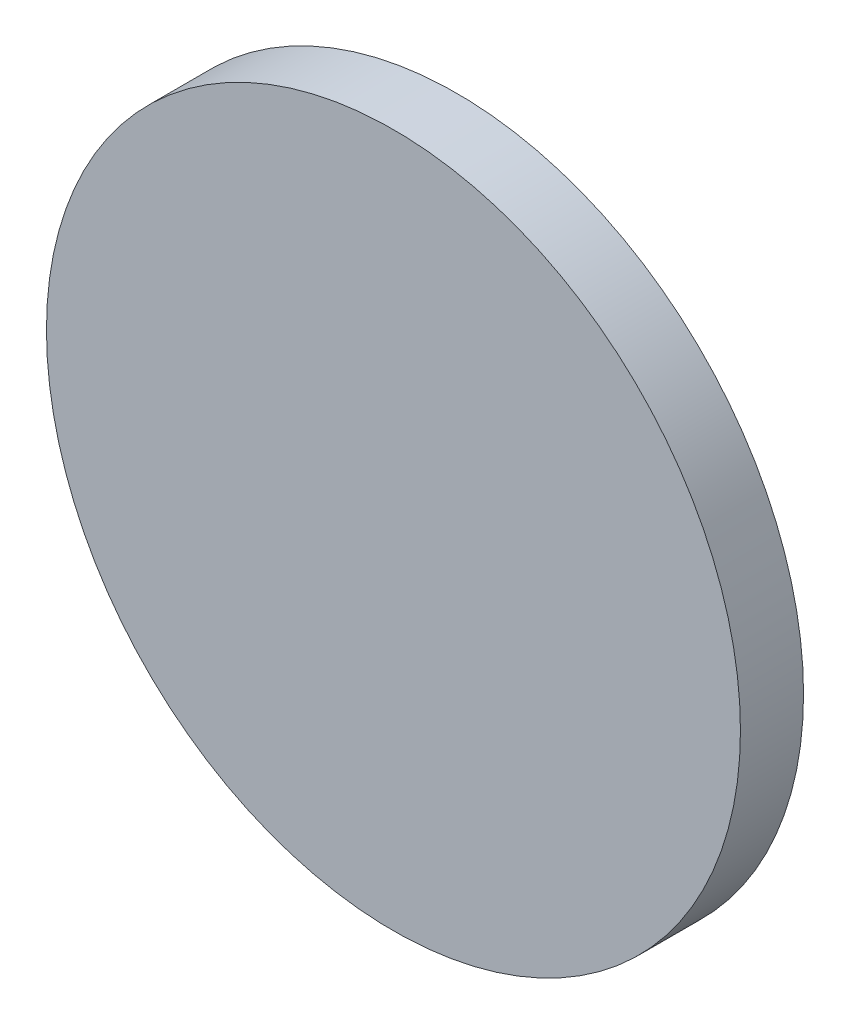
ISO-10303-21;
HEADER;
FILE_DESCRIPTION(('STEP AP214'),'2;1');
FILE_NAME('part.step','',(''),(''),'','','');
FILE_SCHEMA(('AUTOMOTIVE_DESIGN { 1 0 10303 214 1 1 1 1 }'));
ENDSEC;
DATA;
#1=APPLICATION_CONTEXT('core data for automotive mechanical design processes');
#2=APPLICATION_PROTOCOL_DEFINITION('international standard','automotive_design',2000,#1);
#3=PRODUCT_CONTEXT('',#1,'mechanical');
#4=PRODUCT('Part','Part','',(#3));
#5=PRODUCT_RELATED_PRODUCT_CATEGORY('part','',(#4));
#6=PRODUCT_DEFINITION_FORMATION('','',#4);
#7=PRODUCT_DEFINITION_CONTEXT('part definition',#1,'design');
#8=PRODUCT_DEFINITION('design','',#6,#7);
#9=PRODUCT_DEFINITION_SHAPE('','',#8);
#10=(LENGTH_UNIT() NAMED_UNIT(*) SI_UNIT(.MILLI.,.METRE.));
#11=(NAMED_UNIT(*) PLANE_ANGLE_UNIT() SI_UNIT($,.RADIAN.));
#12=(NAMED_UNIT(*) SI_UNIT($,.STERADIAN.) SOLID_ANGLE_UNIT());
#13=UNCERTAINTY_MEASURE_WITH_UNIT(LENGTH_MEASURE(1.E-05),#10,'distance_accuracy_value','');
#14=(GEOMETRIC_REPRESENTATION_CONTEXT(3) GLOBAL_UNCERTAINTY_ASSIGNED_CONTEXT((#13)) GLOBAL_UNIT_ASSIGNED_CONTEXT((#10,
#11,#12)) REPRESENTATION_CONTEXT('',''));
#15=CARTESIAN_POINT('',(0.,0.,0.));
#16=DIRECTION('',(0.,0.,1.));
#17=DIRECTION('',(1.,0.,0.));
#18=AXIS2_PLACEMENT_3D('',#15,#16,#17);
#19=CARTESIAN_POINT('',(0.,0.,2.));
#20=DIRECTION('',(0.,0.,-1.));
#21=DIRECTION('',(-1.,0.,0.));
#22=AXIS2_PLACEMENT_3D('',#19,#20,#21);
#23=CYLINDRICAL_SURFACE('',#22,11.);
#24=CARTESIAN_POINT('',(0.,0.,2.));
#25=DIRECTION('',(0.,0.,1.));
#26=DIRECTION('',(1.,0.,0.));
#27=AXIS2_PLACEMENT_3D('',#24,#25,#26);
#28=CIRCLE('',#27,11.);
#29=CARTESIAN_POINT('',(11.,0.,2.));
#30=VERTEX_POINT('',#29);
#31=EDGE_CURVE('E10',#30,#30,#28,.T.);
#32=ORIENTED_EDGE('',*,*,#31,.F.);
#33=EDGE_LOOP('',(#32));
#34=FACE_BOUND('',#33,.T.);
#35=CARTESIAN_POINT('',(0.,0.,0.));
#36=DIRECTION('',(0.,0.,1.));
#37=DIRECTION('',(1.,0.,0.));
#38=AXIS2_PLACEMENT_3D('',#35,#36,#37);
#39=CIRCLE('',#38,11.);
#40=CARTESIAN_POINT('',(11.,0.,0.));
#41=VERTEX_POINT('',#40);
#42=EDGE_CURVE('E35',#41,#41,#39,.T.);
#43=ORIENTED_EDGE('',*,*,#42,.T.);
#44=EDGE_LOOP('',(#43));
#45=FACE_BOUND('',#44,.T.);
#46=ADVANCED_FACE('F32',(#34,#45),#23,.T.);
#47=CARTESIAN_POINT('',(0.,0.,2.));
#48=DIRECTION('',(0.,0.,1.));
#49=DIRECTION('',(1.,0.,0.));
#50=AXIS2_PLACEMENT_3D('',#47,#48,#49);
#51=PLANE('',#50);
#52=ORIENTED_EDGE('',*,*,#31,.T.);
#53=EDGE_LOOP('',(#52));
#54=FACE_BOUND('',#53,.T.);
#55=ADVANCED_FACE('F47',(#54),#51,.T.);
#56=CARTESIAN_POINT('',(0.,0.,0.));
#57=DIRECTION('',(0.,0.,1.));
#58=DIRECTION('',(1.,0.,0.));
#59=AXIS2_PLACEMENT_3D('',#56,#57,#58);
#60=PLANE('',#59);
#61=ORIENTED_EDGE('',*,*,#42,.F.);
#62=EDGE_LOOP('',(#61));
#63=FACE_BOUND('',#62,.T.);
#64=ADVANCED_FACE('F45',(#63),#60,.F.);
#65=CLOSED_SHELL('',(#46,#55,#64));
#66=MANIFOLD_SOLID_BREP('B2',#65);
#67=ADVANCED_BREP_SHAPE_REPRESENTATION('',(#18,#66),#14);
#68=SHAPE_DEFINITION_REPRESENTATION(#9,#67);
ENDSEC;
END-ISO-10303-21;
